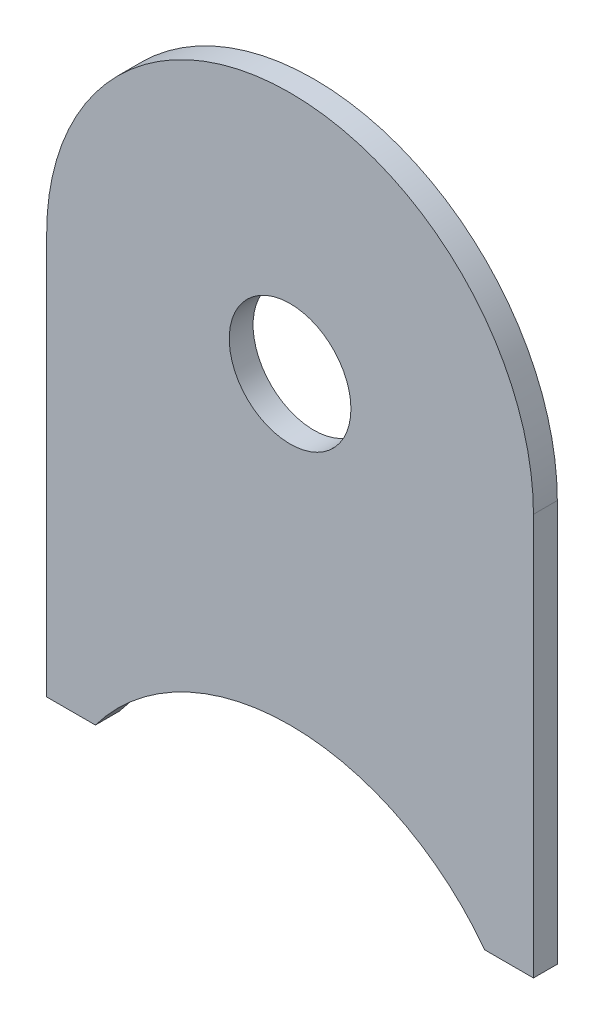
ISO-10303-21;
HEADER;
FILE_DESCRIPTION(('STEP AP214'),'2;1');
FILE_NAME('part.step','',(''),(''),'','','');
FILE_SCHEMA(('AUTOMOTIVE_DESIGN { 1 0 10303 214 1 1 1 1 }'));
ENDSEC;
DATA;
#1=APPLICATION_CONTEXT('core data for automotive mechanical design processes');
#2=APPLICATION_PROTOCOL_DEFINITION('international standard','automotive_design',2000,#1);
#3=PRODUCT_CONTEXT('',#1,'mechanical');
#4=PRODUCT('Part','Part','',(#3));
#5=PRODUCT_RELATED_PRODUCT_CATEGORY('part','',(#4));
#6=PRODUCT_DEFINITION_FORMATION('','',#4);
#7=PRODUCT_DEFINITION_CONTEXT('part definition',#1,'design');
#8=PRODUCT_DEFINITION('design','',#6,#7);
#9=PRODUCT_DEFINITION_SHAPE('','',#8);
#10=(LENGTH_UNIT() NAMED_UNIT(*) SI_UNIT(.MILLI.,.METRE.));
#11=(NAMED_UNIT(*) PLANE_ANGLE_UNIT() SI_UNIT($,.RADIAN.));
#12=(NAMED_UNIT(*) SI_UNIT($,.STERADIAN.) SOLID_ANGLE_UNIT());
#13=UNCERTAINTY_MEASURE_WITH_UNIT(LENGTH_MEASURE(1.E-05),#10,'distance_accuracy_value','');
#14=(GEOMETRIC_REPRESENTATION_CONTEXT(3) GLOBAL_UNCERTAINTY_ASSIGNED_CONTEXT((#13)) GLOBAL_UNIT_ASSIGNED_CONTEXT((#10,
#11,#12)) REPRESENTATION_CONTEXT('',''));
#15=CARTESIAN_POINT('',(0.,0.,0.));
#16=DIRECTION('',(0.,0.,1.));
#17=DIRECTION('',(1.,0.,0.));
#18=AXIS2_PLACEMENT_3D('',#15,#16,#17);
#19=CARTESIAN_POINT('',(12.7,20.955,1.2446));
#20=DIRECTION('',(0.,0.,-1.));
#21=DIRECTION('',(-1.,0.,0.));
#22=AXIS2_PLACEMENT_3D('',#19,#20,#21);
#23=PLANE('',#22);
#24=DIRECTION('',(0.,-1.,0.));
#25=VECTOR('',#24,1.);
#26=CARTESIAN_POINT('',(0.,0.,1.2446));
#27=LINE('',#26,#25);
#28=CARTESIAN_POINT('',(0.,20.955,1.2446));
#29=VERTEX_POINT('',#28);
#30=CARTESIAN_POINT('',(0.,0.,1.2446));
#31=VERTEX_POINT('',#30);
#32=EDGE_CURVE('E152',#29,#31,#27,.T.);
#33=ORIENTED_EDGE('',*,*,#32,.T.);
#34=DIRECTION('',(1.,0.,0.));
#35=VECTOR('',#34,1.);
#36=CARTESIAN_POINT('',(0.,0.,1.2446));
#37=LINE('',#36,#35);
#38=CARTESIAN_POINT('',(2.53999999999999,0.,1.2446));
#39=VERTEX_POINT('',#38);
#40=EDGE_CURVE('E100',#31,#39,#37,.T.);
#41=ORIENTED_EDGE('',*,*,#40,.T.);
#42=CARTESIAN_POINT('',(12.7,-7.62,1.2446));
#43=DIRECTION('',(0.,0.,-1.));
#44=DIRECTION('',(1.,0.,0.));
#45=AXIS2_PLACEMENT_3D('',#42,#43,#44);
#46=CIRCLE('',#45,12.7);
#47=CARTESIAN_POINT('',(22.86,0.,1.2446));
#48=VERTEX_POINT('',#47);
#49=EDGE_CURVE('E113',#39,#48,#46,.T.);
#50=ORIENTED_EDGE('',*,*,#49,.T.);
#51=DIRECTION('',(1.,0.,0.));
#52=VECTOR('',#51,1.);
#53=CARTESIAN_POINT('',(22.86,0.,1.2446));
#54=LINE('',#53,#52);
#55=CARTESIAN_POINT('',(25.4,0.,1.2446));
#56=VERTEX_POINT('',#55);
#57=EDGE_CURVE('E107',#48,#56,#54,.T.);
#58=ORIENTED_EDGE('',*,*,#57,.T.);
#59=DIRECTION('',(0.,1.,0.));
#60=VECTOR('',#59,1.);
#61=CARTESIAN_POINT('',(25.4,0.,1.2446));
#62=LINE('',#61,#60);
#63=CARTESIAN_POINT('',(25.4,20.955,1.2446));
#64=VERTEX_POINT('',#63);
#65=EDGE_CURVE('E111',#56,#64,#62,.T.);
#66=ORIENTED_EDGE('',*,*,#65,.T.);
#67=CARTESIAN_POINT('',(12.7,20.955,1.2446));
#68=DIRECTION('',(0.,0.,1.));
#69=DIRECTION('',(-1.,0.,0.));
#70=AXIS2_PLACEMENT_3D('',#67,#68,#69);
#71=CIRCLE('',#70,12.7);
#72=EDGE_CURVE('E63',#64,#29,#71,.T.);
#73=ORIENTED_EDGE('',*,*,#72,.T.);
#74=EDGE_LOOP('',(#33,#41,#50,#58,#66,#73));
#75=FACE_BOUND('',#74,.T.);
#76=CARTESIAN_POINT('',(12.7,20.955,1.2446));
#77=DIRECTION('',(0.,0.,1.));
#78=DIRECTION('',(1.,0.,0.));
#79=AXIS2_PLACEMENT_3D('',#76,#77,#78);
#80=CIRCLE('',#79,3.175);
#81=CARTESIAN_POINT('',(15.875,20.955,1.2446));
#82=VERTEX_POINT('',#81);
#83=EDGE_CURVE('E140',#82,#82,#80,.T.);
#84=ORIENTED_EDGE('',*,*,#83,.F.);
#85=EDGE_LOOP('',(#84));
#86=FACE_BOUND('',#85,.T.);
#87=ADVANCED_FACE('F45',(#75,#86),#23,.F.);
#88=CARTESIAN_POINT('',(12.7,20.955,0.));
#89=DIRECTION('',(0.,0.,-1.));
#90=DIRECTION('',(-1.,0.,0.));
#91=AXIS2_PLACEMENT_3D('',#88,#89,#90);
#92=PLANE('',#91);
#93=DIRECTION('',(0.,-1.,0.));
#94=VECTOR('',#93,1.);
#95=CARTESIAN_POINT('',(0.,0.,0.));
#96=LINE('',#95,#94);
#97=CARTESIAN_POINT('',(0.,20.955,0.));
#98=VERTEX_POINT('',#97);
#99=CARTESIAN_POINT('',(0.,0.,0.));
#100=VERTEX_POINT('',#99);
#101=EDGE_CURVE('E135',#98,#100,#96,.T.);
#102=ORIENTED_EDGE('',*,*,#101,.F.);
#103=CARTESIAN_POINT('',(12.7,20.955,0.));
#104=DIRECTION('',(0.,0.,1.));
#105=DIRECTION('',(-1.,0.,0.));
#106=AXIS2_PLACEMENT_3D('',#103,#104,#105);
#107=CIRCLE('',#106,12.7);
#108=CARTESIAN_POINT('',(25.4,20.955,0.));
#109=VERTEX_POINT('',#108);
#110=EDGE_CURVE('E92',#109,#98,#107,.T.);
#111=ORIENTED_EDGE('',*,*,#110,.F.);
#112=DIRECTION('',(0.,1.,0.));
#113=VECTOR('',#112,1.);
#114=CARTESIAN_POINT('',(25.4,0.,0.));
#115=LINE('',#114,#113);
#116=CARTESIAN_POINT('',(25.4,0.,0.));
#117=VERTEX_POINT('',#116);
#118=EDGE_CURVE('E86',#117,#109,#115,.T.);
#119=ORIENTED_EDGE('',*,*,#118,.F.);
#120=DIRECTION('',(1.,0.,0.));
#121=VECTOR('',#120,1.);
#122=CARTESIAN_POINT('',(22.86,0.,0.));
#123=LINE('',#122,#121);
#124=CARTESIAN_POINT('',(22.86,0.,0.));
#125=VERTEX_POINT('',#124);
#126=EDGE_CURVE('E122',#125,#117,#123,.T.);
#127=ORIENTED_EDGE('',*,*,#126,.F.);
#128=CARTESIAN_POINT('',(12.7,-7.62,0.));
#129=DIRECTION('',(0.,0.,-1.));
#130=DIRECTION('',(1.,0.,0.));
#131=AXIS2_PLACEMENT_3D('',#128,#129,#130);
#132=CIRCLE('',#131,12.7);
#133=CARTESIAN_POINT('',(2.53999999999999,0.,0.));
#134=VERTEX_POINT('',#133);
#135=EDGE_CURVE('E143',#134,#125,#132,.T.);
#136=ORIENTED_EDGE('',*,*,#135,.F.);
#137=DIRECTION('',(1.,0.,0.));
#138=VECTOR('',#137,1.);
#139=CARTESIAN_POINT('',(0.,0.,0.));
#140=LINE('',#139,#138);
#141=EDGE_CURVE('E139',#100,#134,#140,.T.);
#142=ORIENTED_EDGE('',*,*,#141,.F.);
#143=EDGE_LOOP('',(#102,#111,#119,#127,#136,#142));
#144=FACE_BOUND('',#143,.T.);
#145=CARTESIAN_POINT('',(12.7,20.955,0.));
#146=DIRECTION('',(0.,0.,1.));
#147=DIRECTION('',(1.,0.,0.));
#148=AXIS2_PLACEMENT_3D('',#145,#146,#147);
#149=CIRCLE('',#148,3.175);
#150=CARTESIAN_POINT('',(15.875,20.955,0.));
#151=VERTEX_POINT('',#150);
#152=EDGE_CURVE('E249',#151,#151,#149,.T.);
#153=ORIENTED_EDGE('',*,*,#152,.T.);
#154=EDGE_LOOP('',(#153));
#155=FACE_BOUND('',#154,.T.);
#156=ADVANCED_FACE('F165',(#144,#155),#92,.T.);
#157=CARTESIAN_POINT('',(0.,0.,1.2446));
#158=DIRECTION('',(1.,0.,0.));
#159=DIRECTION('',(0.,0.,-1.));
#160=AXIS2_PLACEMENT_3D('',#157,#158,#159);
#161=PLANE('',#160);
#162=ORIENTED_EDGE('',*,*,#101,.T.);
#163=DIRECTION('',(0.,0.,-1.));
#164=VECTOR('',#163,1.);
#165=CARTESIAN_POINT('',(0.,0.,1.2446));
#166=LINE('',#165,#164);
#167=EDGE_CURVE('E11',#31,#100,#166,.T.);
#168=ORIENTED_EDGE('',*,*,#167,.F.);
#169=ORIENTED_EDGE('',*,*,#32,.F.);
#170=DIRECTION('',(0.,0.,-1.));
#171=VECTOR('',#170,1.);
#172=CARTESIAN_POINT('',(0.,20.955,1.2446));
#173=LINE('',#172,#171);
#174=EDGE_CURVE('E131',#29,#98,#173,.T.);
#175=ORIENTED_EDGE('',*,*,#174,.T.);
#176=EDGE_LOOP('',(#162,#168,#169,#175));
#177=FACE_BOUND('',#176,.T.);
#178=ADVANCED_FACE('F47',(#177),#161,.F.);
#179=CARTESIAN_POINT('',(0.,0.,1.2446));
#180=DIRECTION('',(0.,1.,0.));
#181=DIRECTION('',(0.,0.,1.));
#182=AXIS2_PLACEMENT_3D('',#179,#180,#181);
#183=PLANE('',#182);
#184=ORIENTED_EDGE('',*,*,#141,.T.);
#185=DIRECTION('',(0.,0.,-1.));
#186=VECTOR('',#185,1.);
#187=CARTESIAN_POINT('',(2.53999999999999,0.,1.2446));
#188=LINE('',#187,#186);
#189=EDGE_CURVE('E55',#39,#134,#188,.T.);
#190=ORIENTED_EDGE('',*,*,#189,.F.);
#191=ORIENTED_EDGE('',*,*,#40,.F.);
#192=ORIENTED_EDGE('',*,*,#167,.T.);
#193=EDGE_LOOP('',(#184,#190,#191,#192));
#194=FACE_BOUND('',#193,.T.);
#195=ADVANCED_FACE('F190',(#194),#183,.F.);
#196=CARTESIAN_POINT('',(12.7,-7.62,1.2446));
#197=DIRECTION('',(0.,0.,-1.));
#198=DIRECTION('',(-1.,0.,0.));
#199=AXIS2_PLACEMENT_3D('',#196,#197,#198);
#200=CYLINDRICAL_SURFACE('',#199,12.7);
#201=ORIENTED_EDGE('',*,*,#135,.T.);
#202=DIRECTION('',(0.,0.,-1.));
#203=VECTOR('',#202,1.);
#204=CARTESIAN_POINT('',(22.86,0.,1.2446));
#205=LINE('',#204,#203);
#206=EDGE_CURVE('E124',#48,#125,#205,.T.);
#207=ORIENTED_EDGE('',*,*,#206,.F.);
#208=ORIENTED_EDGE('',*,*,#49,.F.);
#209=ORIENTED_EDGE('',*,*,#189,.T.);
#210=EDGE_LOOP('',(#201,#207,#208,#209));
#211=FACE_BOUND('',#210,.T.);
#212=ADVANCED_FACE('F162',(#211),#200,.F.);
#213=CARTESIAN_POINT('',(22.86,0.,1.2446));
#214=DIRECTION('',(0.,1.,0.));
#215=DIRECTION('',(0.,0.,1.));
#216=AXIS2_PLACEMENT_3D('',#213,#214,#215);
#217=PLANE('',#216);
#218=ORIENTED_EDGE('',*,*,#126,.T.);
#219=DIRECTION('',(0.,0.,-1.));
#220=VECTOR('',#219,1.);
#221=CARTESIAN_POINT('',(25.4,0.,1.2446));
#222=LINE('',#221,#220);
#223=EDGE_CURVE('E119',#56,#117,#222,.T.);
#224=ORIENTED_EDGE('',*,*,#223,.F.);
#225=ORIENTED_EDGE('',*,*,#57,.F.);
#226=ORIENTED_EDGE('',*,*,#206,.T.);
#227=EDGE_LOOP('',(#218,#224,#225,#226));
#228=FACE_BOUND('',#227,.T.);
#229=ADVANCED_FACE('F120',(#228),#217,.F.);
#230=CARTESIAN_POINT('',(25.4,0.,1.2446));
#231=DIRECTION('',(-1.,0.,0.));
#232=DIRECTION('',(0.,0.,1.));
#233=AXIS2_PLACEMENT_3D('',#230,#231,#232);
#234=PLANE('',#233);
#235=ORIENTED_EDGE('',*,*,#118,.T.);
#236=DIRECTION('',(0.,0.,-1.));
#237=VECTOR('',#236,1.);
#238=CARTESIAN_POINT('',(25.4,20.955,1.2446));
#239=LINE('',#238,#237);
#240=EDGE_CURVE('E125',#64,#109,#239,.T.);
#241=ORIENTED_EDGE('',*,*,#240,.F.);
#242=ORIENTED_EDGE('',*,*,#65,.F.);
#243=ORIENTED_EDGE('',*,*,#223,.T.);
#244=EDGE_LOOP('',(#235,#241,#242,#243));
#245=FACE_BOUND('',#244,.T.);
#246=ADVANCED_FACE('F127',(#245),#234,.F.);
#247=CARTESIAN_POINT('',(12.7,20.955,1.2446));
#248=DIRECTION('',(0.,0.,-1.));
#249=DIRECTION('',(-1.,0.,0.));
#250=AXIS2_PLACEMENT_3D('',#247,#248,#249);
#251=CYLINDRICAL_SURFACE('',#250,12.7);
#252=ORIENTED_EDGE('',*,*,#110,.T.);
#253=ORIENTED_EDGE('',*,*,#174,.F.);
#254=ORIENTED_EDGE('',*,*,#72,.F.);
#255=ORIENTED_EDGE('',*,*,#240,.T.);
#256=EDGE_LOOP('',(#252,#253,#254,#255));
#257=FACE_BOUND('',#256,.T.);
#258=ADVANCED_FACE('F170',(#257),#251,.T.);
#259=CARTESIAN_POINT('',(12.7,20.955,1.2446));
#260=DIRECTION('',(0.,0.,-1.));
#261=DIRECTION('',(-1.,0.,0.));
#262=AXIS2_PLACEMENT_3D('',#259,#260,#261);
#263=CYLINDRICAL_SURFACE('',#262,3.175);
#264=ORIENTED_EDGE('',*,*,#83,.T.);
#265=EDGE_LOOP('',(#264));
#266=FACE_BOUND('',#265,.T.);
#267=ORIENTED_EDGE('',*,*,#152,.F.);
#268=EDGE_LOOP('',(#267));
#269=FACE_BOUND('',#268,.T.);
#270=ADVANCED_FACE('F172',(#266,#269),#263,.F.);
#271=CLOSED_SHELL('',(#87,#156,#178,#195,#212,#229,#246,#258,#270));
#272=MANIFOLD_SOLID_BREP('B2',#271);
#273=ADVANCED_BREP_SHAPE_REPRESENTATION('',(#18,#272),#14);
#274=SHAPE_DEFINITION_REPRESENTATION(#9,#273);
ENDSEC;
END-ISO-10303-21;
